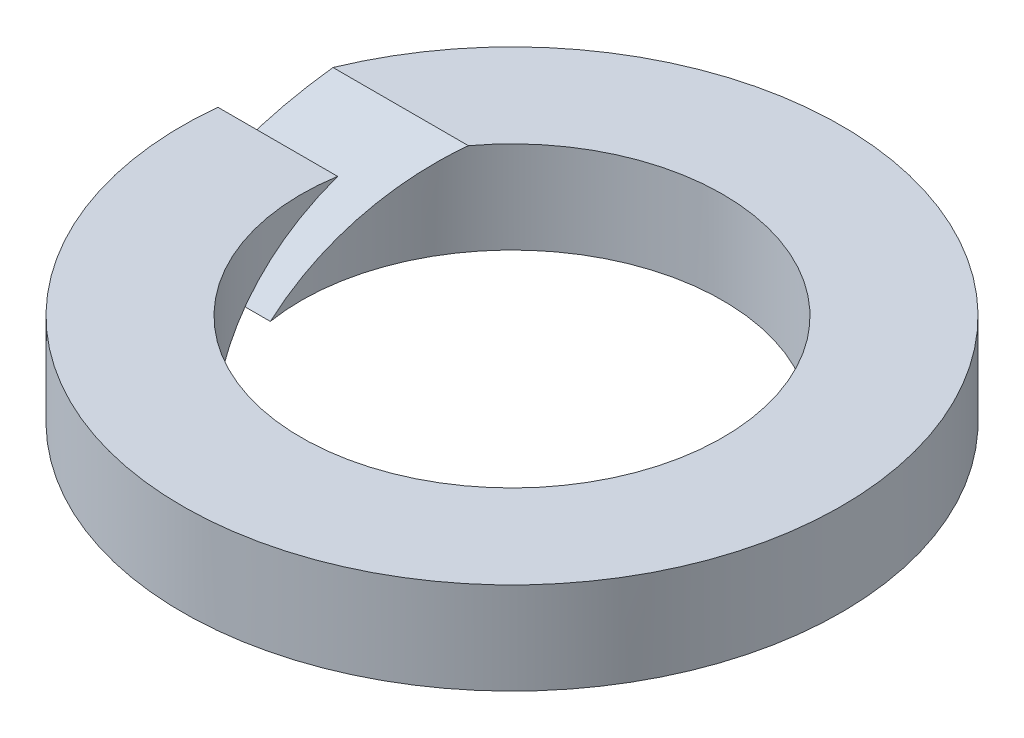
ISO-10303-21;
HEADER;
FILE_DESCRIPTION(('STEP AP214'),'2;1');
FILE_NAME('part.step','',(''),(''),'','','');
FILE_SCHEMA(('AUTOMOTIVE_DESIGN { 1 0 10303 214 1 1 1 1 }'));
ENDSEC;
DATA;
#1=APPLICATION_CONTEXT('core data for automotive mechanical design processes');
#2=APPLICATION_PROTOCOL_DEFINITION('international standard','automotive_design',2000,#1);
#3=PRODUCT_CONTEXT('',#1,'mechanical');
#4=PRODUCT('Part','Part','',(#3));
#5=PRODUCT_RELATED_PRODUCT_CATEGORY('part','',(#4));
#6=PRODUCT_DEFINITION_FORMATION('','',#4);
#7=PRODUCT_DEFINITION_CONTEXT('part definition',#1,'design');
#8=PRODUCT_DEFINITION('design','',#6,#7);
#9=PRODUCT_DEFINITION_SHAPE('','',#8);
#10=(LENGTH_UNIT() NAMED_UNIT(*) SI_UNIT(.MILLI.,.METRE.));
#11=(NAMED_UNIT(*) PLANE_ANGLE_UNIT() SI_UNIT($,.RADIAN.));
#12=(NAMED_UNIT(*) SI_UNIT($,.STERADIAN.) SOLID_ANGLE_UNIT());
#13=UNCERTAINTY_MEASURE_WITH_UNIT(LENGTH_MEASURE(1.E-05),#10,'distance_accuracy_value','');
#14=(GEOMETRIC_REPRESENTATION_CONTEXT(3) GLOBAL_UNCERTAINTY_ASSIGNED_CONTEXT((#13)) GLOBAL_UNIT_ASSIGNED_CONTEXT((#10,
#11,#12)) REPRESENTATION_CONTEXT('',''));
#15=CARTESIAN_POINT('',(0.,0.,0.));
#16=DIRECTION('',(0.,0.,1.));
#17=DIRECTION('',(1.,0.,0.));
#18=AXIS2_PLACEMENT_3D('',#15,#16,#17);
#19=CARTESIAN_POINT('',(0.,6.,0.));
#20=DIRECTION('',(0.,1.,0.));
#21=DIRECTION('',(0.,0.,1.));
#22=AXIS2_PLACEMENT_3D('',#19,#20,#21);
#23=PLANE('',#22);
#24=DIRECTION('',(1.,0.,0.));
#25=VECTOR('',#24,1.);
#26=CARTESIAN_POINT('',(-21.5,6.,-2.19615242270662));
#27=LINE('',#26,#25);
#28=CARTESIAN_POINT('',(-21.3875411054249,6.,-2.19615242270662));
#29=VERTEX_POINT('',#28);
#30=CARTESIAN_POINT('',(-13.5734820343285,6.,-2.19615242270662));
#31=VERTEX_POINT('',#30);
#32=EDGE_CURVE('E57',#29,#31,#27,.T.);
#33=ORIENTED_EDGE('',*,*,#32,.F.);
#34=CARTESIAN_POINT('',(0.,6.,0.));
#35=DIRECTION('',(0.,1.,0.));
#36=DIRECTION('',(0.,0.,1.));
#37=AXIS2_PLACEMENT_3D('',#34,#35,#36);
#38=CIRCLE('',#37,21.5);
#39=CARTESIAN_POINT('',(-19.8764454936933,6.,-8.19615242270661));
#40=VERTEX_POINT('',#39);
#41=EDGE_CURVE('E80',#29,#40,#38,.T.);
#42=ORIENTED_EDGE('',*,*,#41,.T.);
#43=DIRECTION('',(1.,0.,0.));
#44=VECTOR('',#43,1.);
#45=CARTESIAN_POINT('',(-21.5,6.,-8.19615242270661));
#46=LINE('',#45,#44);
#47=CARTESIAN_POINT('',(-11.0401804996006,6.,-8.19615242270661));
#48=VERTEX_POINT('',#47);
#49=EDGE_CURVE('E101',#40,#48,#46,.T.);
#50=ORIENTED_EDGE('',*,*,#49,.T.);
#51=CARTESIAN_POINT('',(0.,6.,0.));
#52=DIRECTION('',(0.,1.,0.));
#53=DIRECTION('',(0.,0.,1.));
#54=AXIS2_PLACEMENT_3D('',#51,#52,#53);
#55=CIRCLE('',#54,13.75);
#56=EDGE_CURVE('E92',#31,#48,#55,.T.);
#57=ORIENTED_EDGE('',*,*,#56,.F.);
#58=EDGE_LOOP('',(#33,#42,#50,#57));
#59=FACE_BOUND('',#58,.T.);
#60=ADVANCED_FACE('F35',(#59),#23,.T.);
#61=CARTESIAN_POINT('',(0.,0.,0.));
#62=DIRECTION('',(0.,1.,0.));
#63=DIRECTION('',(0.,0.,1.));
#64=AXIS2_PLACEMENT_3D('',#61,#62,#63);
#65=PLANE('',#64);
#66=CARTESIAN_POINT('',(0.,0.,0.));
#67=DIRECTION('',(0.,1.,0.));
#68=DIRECTION('',(0.,0.,1.));
#69=AXIS2_PLACEMENT_3D('',#66,#67,#68);
#70=CIRCLE('',#69,21.5);
#71=CARTESIAN_POINT('',(-19.8764454936933,0.,8.19615242270661));
#72=VERTEX_POINT('',#71);
#73=CARTESIAN_POINT('',(-21.3875411054249,0.,2.19615242270662));
#74=VERTEX_POINT('',#73);
#75=EDGE_CURVE('E78',#72,#74,#70,.T.);
#76=ORIENTED_EDGE('',*,*,#75,.F.);
#77=DIRECTION('',(1.,0.,0.));
#78=VECTOR('',#77,1.);
#79=CARTESIAN_POINT('',(-21.5,0.,8.19615242270661));
#80=LINE('',#79,#78);
#81=CARTESIAN_POINT('',(-11.0401804996006,0.,8.19615242270661));
#82=VERTEX_POINT('',#81);
#83=EDGE_CURVE('E85',#72,#82,#80,.T.);
#84=ORIENTED_EDGE('',*,*,#83,.T.);
#85=CARTESIAN_POINT('',(0.,0.,0.));
#86=DIRECTION('',(0.,1.,0.));
#87=DIRECTION('',(0.,0.,1.));
#88=AXIS2_PLACEMENT_3D('',#85,#86,#87);
#89=CIRCLE('',#88,13.75);
#90=CARTESIAN_POINT('',(-13.5734820343285,0.,2.19615242270662));
#91=VERTEX_POINT('',#90);
#92=EDGE_CURVE('E81',#82,#91,#89,.T.);
#93=ORIENTED_EDGE('',*,*,#92,.T.);
#94=DIRECTION('',(1.,0.,0.));
#95=VECTOR('',#94,1.);
#96=CARTESIAN_POINT('',(-21.5,0.,2.19615242270662));
#97=LINE('',#96,#95);
#98=EDGE_CURVE('E50',#74,#91,#97,.T.);
#99=ORIENTED_EDGE('',*,*,#98,.F.);
#100=EDGE_LOOP('',(#76,#84,#93,#99));
#101=FACE_BOUND('',#100,.T.);
#102=ADVANCED_FACE('F91',(#101),#65,.F.);
#103=CARTESIAN_POINT('',(0.,6.,0.));
#104=DIRECTION('',(0.,-1.,0.));
#105=DIRECTION('',(0.,0.,-1.));
#106=AXIS2_PLACEMENT_3D('',#103,#104,#105);
#107=CYLINDRICAL_SURFACE('',#106,21.5);
#108=ORIENTED_EDGE('',*,*,#41,.F.);
#109=CARTESIAN_POINT('',(0.,4.73205080756888,0.));
#110=DIRECTION('',(0.,0.866025403784438,0.500000000000001));
#111=DIRECTION('',(0.,-0.500000000000001,0.866025403784438));
#112=AXIS2_PLACEMENT_3D('',#109,#110,#111);
#113=ELLIPSE('',#112,24.8260615751539,21.5);
#114=EDGE_CURVE('E75',#29,#72,#113,.T.);
#115=ORIENTED_EDGE('',*,*,#114,.T.);
#116=ORIENTED_EDGE('',*,*,#75,.T.);
#117=CARTESIAN_POINT('',(0.,1.26794919243112,0.));
#118=DIRECTION('',(0.,-0.866025403784438,-0.500000000000001));
#119=DIRECTION('',(0.,-0.500000000000001,0.866025403784438));
#120=AXIS2_PLACEMENT_3D('',#117,#118,#119);
#121=ELLIPSE('',#120,24.8260615751539,21.5);
#122=EDGE_CURVE('E82',#74,#40,#121,.T.);
#123=ORIENTED_EDGE('',*,*,#122,.T.);
#124=EDGE_LOOP('',(#108,#115,#116,#123));
#125=FACE_BOUND('',#124,.T.);
#126=ADVANCED_FACE('F37',(#125),#107,.T.);
#127=CARTESIAN_POINT('',(0.,6.,0.));
#128=DIRECTION('',(0.,-1.,0.));
#129=DIRECTION('',(0.,0.,-1.));
#130=AXIS2_PLACEMENT_3D('',#127,#128,#129);
#131=CYLINDRICAL_SURFACE('',#130,13.75);
#132=CARTESIAN_POINT('',(0.,4.73205080756888,0.));
#133=DIRECTION('',(0.,0.866025403784438,0.500000000000001));
#134=DIRECTION('',(0.,-0.500000000000001,0.866025403784438));
#135=AXIS2_PLACEMENT_3D('',#132,#133,#134);
#136=ELLIPSE('',#135,15.8771324027147,13.75);
#137=EDGE_CURVE('E11',#31,#82,#136,.T.);
#138=ORIENTED_EDGE('',*,*,#137,.F.);
#139=ORIENTED_EDGE('',*,*,#56,.T.);
#140=CARTESIAN_POINT('',(0.,1.26794919243112,0.));
#141=DIRECTION('',(0.,-0.866025403784438,-0.500000000000001));
#142=DIRECTION('',(0.,-0.500000000000001,0.866025403784438));
#143=AXIS2_PLACEMENT_3D('',#140,#141,#142);
#144=ELLIPSE('',#143,15.8771324027147,13.75);
#145=EDGE_CURVE('E43',#91,#48,#144,.T.);
#146=ORIENTED_EDGE('',*,*,#145,.F.);
#147=ORIENTED_EDGE('',*,*,#92,.F.);
#148=EDGE_LOOP('',(#138,#139,#146,#147));
#149=FACE_BOUND('',#148,.T.);
#150=ADVANCED_FACE('F106',(#149),#131,.F.);
#151=CARTESIAN_POINT('',(-21.5,0.,2.19615242270662));
#152=DIRECTION('',(0.,-0.866025403784438,-0.500000000000001));
#153=DIRECTION('',(0.,0.500000000000001,-0.866025403784438));
#154=AXIS2_PLACEMENT_3D('',#151,#152,#153);
#155=PLANE('',#154);
#156=ORIENTED_EDGE('',*,*,#98,.T.);
#157=ORIENTED_EDGE('',*,*,#145,.T.);
#158=ORIENTED_EDGE('',*,*,#49,.F.);
#159=ORIENTED_EDGE('',*,*,#122,.F.);
#160=EDGE_LOOP('',(#156,#157,#158,#159));
#161=FACE_BOUND('',#160,.T.);
#162=ADVANCED_FACE('F100',(#161),#155,.F.);
#163=CARTESIAN_POINT('',(-21.5,0.,8.19615242270661));
#164=DIRECTION('',(0.,0.866025403784438,0.500000000000001));
#165=DIRECTION('',(0.,-0.500000000000001,0.866025403784438));
#166=AXIS2_PLACEMENT_3D('',#163,#164,#165);
#167=PLANE('',#166);
#168=ORIENTED_EDGE('',*,*,#32,.T.);
#169=ORIENTED_EDGE('',*,*,#137,.T.);
#170=ORIENTED_EDGE('',*,*,#83,.F.);
#171=ORIENTED_EDGE('',*,*,#114,.F.);
#172=EDGE_LOOP('',(#168,#169,#170,#171));
#173=FACE_BOUND('',#172,.T.);
#174=ADVANCED_FACE('F86',(#173),#167,.F.);
#175=CLOSED_SHELL('',(#60,#102,#126,#150,#162,#174));
#176=MANIFOLD_SOLID_BREP('B2',#175);
#177=ADVANCED_BREP_SHAPE_REPRESENTATION('',(#18,#176),#14);
#178=SHAPE_DEFINITION_REPRESENTATION(#9,#177);
ENDSEC;
END-ISO-10303-21;
